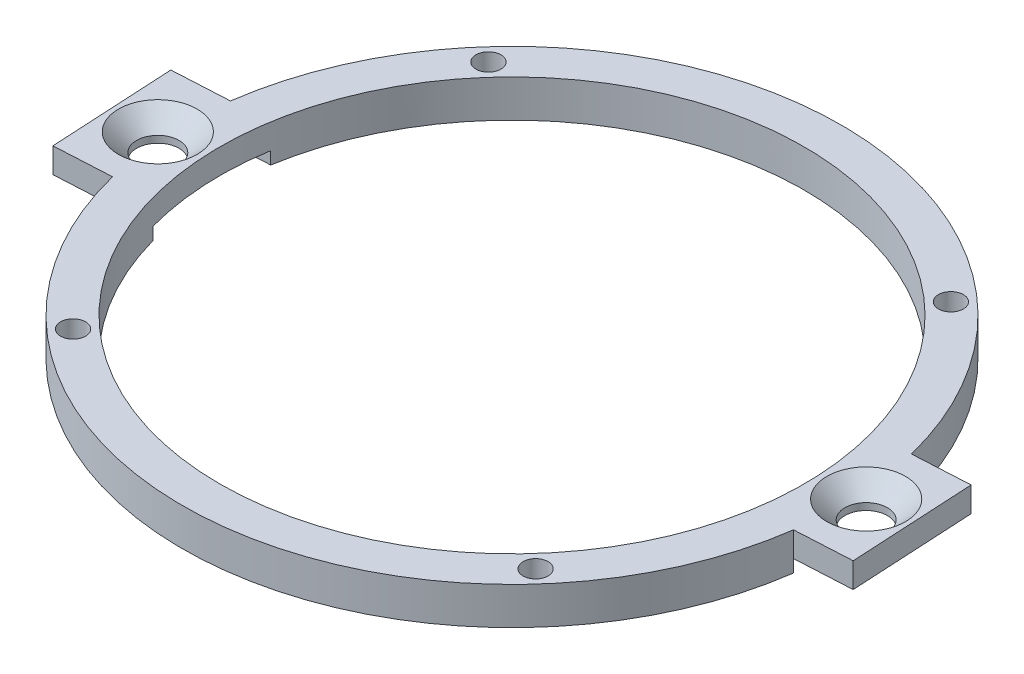
ISO-10303-21;
HEADER;
FILE_DESCRIPTION(('STEP AP214'),'2;1');
FILE_NAME('part.step','',(''),(''),'','','');
FILE_SCHEMA(('AUTOMOTIVE_DESIGN { 1 0 10303 214 1 1 1 1 }'));
ENDSEC;
DATA;
#1=APPLICATION_CONTEXT('core data for automotive mechanical design processes');
#2=APPLICATION_PROTOCOL_DEFINITION('international standard','automotive_design',2000,#1);
#3=PRODUCT_CONTEXT('',#1,'mechanical');
#4=PRODUCT('Part','Part','',(#3));
#5=PRODUCT_RELATED_PRODUCT_CATEGORY('part','',(#4));
#6=PRODUCT_DEFINITION_FORMATION('','',#4);
#7=PRODUCT_DEFINITION_CONTEXT('part definition',#1,'design');
#8=PRODUCT_DEFINITION('design','',#6,#7);
#9=PRODUCT_DEFINITION_SHAPE('','',#8);
#10=(LENGTH_UNIT() NAMED_UNIT(*) SI_UNIT(.MILLI.,.METRE.));
#11=(NAMED_UNIT(*) PLANE_ANGLE_UNIT() SI_UNIT($,.RADIAN.));
#12=(NAMED_UNIT(*) SI_UNIT($,.STERADIAN.) SOLID_ANGLE_UNIT());
#13=UNCERTAINTY_MEASURE_WITH_UNIT(LENGTH_MEASURE(1.E-05),#10,'distance_accuracy_value','');
#14=(GEOMETRIC_REPRESENTATION_CONTEXT(3) GLOBAL_UNCERTAINTY_ASSIGNED_CONTEXT((#13)) GLOBAL_UNIT_ASSIGNED_CONTEXT((#10,
#11,#12)) REPRESENTATION_CONTEXT('',''));
#15=CARTESIAN_POINT('',(0.,0.,0.));
#16=DIRECTION('',(0.,0.,1.));
#17=DIRECTION('',(1.,0.,0.));
#18=AXIS2_PLACEMENT_3D('',#15,#16,#17);
#19=CARTESIAN_POINT('',(-73.2496011945376,0.,33.2166503223374));
#20=DIRECTION('',(0.,1.,0.));
#21=DIRECTION('',(0.,0.,1.));
#22=AXIS2_PLACEMENT_3D('',#19,#20,#21);
#23=PLANE('',#22);
#24=CARTESIAN_POINT('',(-46.3204437022686,0.,31.7697568374789));
#25=DIRECTION('',(0.,1.,0.));
#26=DIRECTION('',(0.,0.,1.));
#27=AXIS2_PLACEMENT_3D('',#24,#25,#26);
#28=CIRCLE('',#27,1.7);
#29=CARTESIAN_POINT('',(-46.3204437022686,0.,33.4697568374789));
#30=VERTEX_POINT('',#29);
#31=EDGE_CURVE('E180',#30,#30,#28,.T.);
#32=ORIENTED_EDGE('',*,*,#31,.T.);
#33=EDGE_LOOP('',(#32));
#34=FACE_BOUND('',#33,.T.);
#35=CARTESIAN_POINT('',(-73.2496011945376,0.,33.2166503223374));
#36=DIRECTION('',(0.,1.,0.));
#37=DIRECTION('',(0.,0.,1.));
#38=AXIS2_PLACEMENT_3D('',#35,#36,#37);
#39=CIRCLE('',#38,23.4010000013006);
#40=CARTESIAN_POINT('',(-50.1536716128086,0.,36.9829267084631));
#41=VERTEX_POINT('',#40);
#42=CARTESIAN_POINT('',(-50.6901939670287,0.,26.997329892878));
#43=VERTEX_POINT('',#42);
#44=EDGE_CURVE('E53',#41,#43,#39,.T.);
#45=ORIENTED_EDGE('',*,*,#44,.T.);
#46=DIRECTION('',(0.998559681558508,0.,-0.0536522354219361));
#47=VECTOR('',#46,1.);
#48=CARTESIAN_POINT('',(-70.1361416443876,0.,28.0421533341369));
#49=LINE('',#48,#47);
#50=CARTESIAN_POINT('',(-47.6319903502109,0.,26.8330137649109));
#51=VERTEX_POINT('',#50);
#52=EDGE_CURVE('E145',#43,#51,#49,.T.);
#53=ORIENTED_EDGE('',*,*,#52,.T.);
#54=DIRECTION('',(-0.998559681558508,0.,0.053652235421936));
#55=VECTOR('',#54,1.);
#56=CARTESIAN_POINT('',(-46.6157156561829,0.,26.7784097085442));
#57=LINE('',#56,#55);
#58=CARTESIAN_POINT('',(-43.0937459939242,0.,26.5891756057077));
#59=VERTEX_POINT('',#58);
#60=EDGE_CURVE('E257',#59,#51,#57,.T.);
#61=ORIENTED_EDGE('',*,*,#60,.F.);
#62=DIRECTION('',(-0.0536522354219357,0.,-0.998559681558508));
#63=VECTOR('',#62,1.);
#64=CARTESIAN_POINT('',(-43.0937459939242,0.,26.5891756057077));
#65=LINE('',#64,#63);
#66=CARTESIAN_POINT('',(-42.5572236397049,0.,36.5747724212929));
#67=VERTEX_POINT('',#66);
#68=EDGE_CURVE('E282',#67,#59,#65,.T.);
#69=ORIENTED_EDGE('',*,*,#68,.F.);
#70=DIRECTION('',(0.998559681558508,0.,-0.0536522354219357));
#71=VECTOR('',#70,1.);
#72=CARTESIAN_POINT('',(-42.5572236397049,0.,36.5747724212929));
#73=LINE('',#72,#71);
#74=CARTESIAN_POINT('',(-47.0954679959909,0.,36.818610580496));
#75=VERTEX_POINT('',#74);
#76=EDGE_CURVE('E280',#75,#67,#73,.T.);
#77=ORIENTED_EDGE('',*,*,#76,.F.);
#78=DIRECTION('',(0.998559681558508,0.,-0.053652235421934));
#79=VECTOR('',#78,1.);
#80=CARTESIAN_POINT('',(-69.5996192901684,0.,38.0277501497219));
#81=LINE('',#80,#79);
#82=EDGE_CURVE('E147',#41,#75,#81,.T.);
#83=ORIENTED_EDGE('',*,*,#82,.F.);
#84=EDGE_LOOP('',(#45,#53,#61,#69,#77,#83));
#85=FACE_BOUND('',#84,.T.);
#86=ADVANCED_FACE('F36',(#34,#85),#23,.F.);
#87=CARTESIAN_POINT('',(-100.178758686809,0.,34.6635438071964));
#88=DIRECTION('',(0.,1.,0.));
#89=DIRECTION('',(0.,0.,1.));
#90=AXIS2_PLACEMENT_3D('',#87,#88,#89);
#91=CIRCLE('',#90,1.69999999999999);
#92=CARTESIAN_POINT('',(-100.178758686809,0.,36.3635438071964));
#93=VERTEX_POINT('',#92);
#94=EDGE_CURVE('E40',#93,#93,#91,.T.);
#95=ORIENTED_EDGE('',*,*,#94,.T.);
#96=EDGE_LOOP('',(#95));
#97=FACE_BOUND('',#96,.T.);
#98=DIRECTION('',(-0.998559681558508,0.,0.0536522354219358));
#99=VECTOR('',#98,1.);
#100=CARTESIAN_POINT('',(-103.941978749374,0.,29.8585282233788));
#101=LINE('',#100,#99);
#102=CARTESIAN_POINT('',(-99.4037343930838,0.,29.6146900641754));
#103=VERTEX_POINT('',#102);
#104=CARTESIAN_POINT('',(-103.941978749374,0.,29.8585282233788));
#105=VERTEX_POINT('',#104);
#106=EDGE_CURVE('E252',#103,#105,#101,.T.);
#107=ORIENTED_EDGE('',*,*,#106,.F.);
#108=DIRECTION('',(0.998559681558508,0.,-0.053652235421936));
#109=VECTOR('',#108,1.);
#110=CARTESIAN_POINT('',(-70.1361416443876,0.,28.0421533341369));
#111=LINE('',#110,#109);
#112=CARTESIAN_POINT('',(-96.3455307762661,0.,29.4503739362084));
#113=VERTEX_POINT('',#112);
#114=EDGE_CURVE('E164',#103,#113,#111,.T.);
#115=ORIENTED_EDGE('',*,*,#114,.T.);
#116=CARTESIAN_POINT('',(-95.8090084220474,0.,39.4359707517935));
#117=VERTEX_POINT('',#116);
#118=EDGE_CURVE('E61',#113,#117,#39,.T.);
#119=ORIENTED_EDGE('',*,*,#118,.T.);
#120=DIRECTION('',(0.998559681558508,0.,-0.0536522354219365));
#121=VECTOR('',#120,1.);
#122=CARTESIAN_POINT('',(-69.5996192901682,0.,38.0277501497219));
#123=LINE('',#122,#121);
#124=CARTESIAN_POINT('',(-98.8672120388651,0.,39.6002868797605));
#125=VERTEX_POINT('',#124);
#126=EDGE_CURVE('E191',#125,#117,#123,.T.);
#127=ORIENTED_EDGE('',*,*,#126,.F.);
#128=DIRECTION('',(0.998559681558508,0.,-0.0536522354219336));
#129=VECTOR('',#128,1.);
#130=CARTESIAN_POINT('',(-99.8834867328931,0.,39.6548909361273));
#131=LINE('',#130,#129);
#132=CARTESIAN_POINT('',(-103.405456395155,0.,39.8441250389639));
#133=VERTEX_POINT('',#132);
#134=EDGE_CURVE('E277',#133,#125,#131,.T.);
#135=ORIENTED_EDGE('',*,*,#134,.F.);
#136=DIRECTION('',(0.0536522354219374,0.,0.998559681558508));
#137=VECTOR('',#136,1.);
#138=CARTESIAN_POINT('',(-103.405456395155,0.,39.8441250389639));
#139=LINE('',#138,#137);
#140=EDGE_CURVE('E274',#105,#133,#139,.T.);
#141=ORIENTED_EDGE('',*,*,#140,.F.);
#142=EDGE_LOOP('',(#107,#115,#119,#127,#135,#141));
#143=FACE_BOUND('',#142,.T.);
#144=ADVANCED_FACE('F312',(#97,#143),#23,.F.);
#145=CARTESIAN_POINT('',(-73.2496011945376,2.,33.2166503223374));
#146=DIRECTION('',(0.,1.,0.));
#147=DIRECTION('',(0.,0.,1.));
#148=AXIS2_PLACEMENT_3D('',#145,#146,#147);
#149=PLANE('',#148);
#150=CARTESIAN_POINT('',(-100.178758686809,2.,34.6635438071964));
#151=DIRECTION('',(0.,1.,0.));
#152=DIRECTION('',(0.,0.,1.));
#153=AXIS2_PLACEMENT_3D('',#150,#151,#152);
#154=CIRCLE('',#153,3.15);
#155=CARTESIAN_POINT('',(-100.178758686809,2.,37.8135438071964));
#156=VERTEX_POINT('',#155);
#157=EDGE_CURVE('E396',#156,#156,#154,.T.);
#158=ORIENTED_EDGE('',*,*,#157,.F.);
#159=EDGE_LOOP('',(#158));
#160=FACE_BOUND('',#159,.T.);
#161=CARTESIAN_POINT('',(-46.3204437022686,2.,31.7697568374789));
#162=DIRECTION('',(0.,1.,0.));
#163=DIRECTION('',(0.,0.,1.));
#164=AXIS2_PLACEMENT_3D('',#161,#162,#163);
#165=CIRCLE('',#164,3.15);
#166=CARTESIAN_POINT('',(-46.3204437022686,2.,34.9197568374789));
#167=VERTEX_POINT('',#166);
#168=EDGE_CURVE('E400',#167,#167,#165,.T.);
#169=ORIENTED_EDGE('',*,*,#168,.F.);
#170=EDGE_LOOP('',(#169));
#171=FACE_BOUND('',#170,.T.);
#172=CARTESIAN_POINT('',(-89.8872158685172,2.,51.7436462748696));
#173=DIRECTION('',(0.,1.,0.));
#174=DIRECTION('',(0.,0.,1.));
#175=AXIS2_PLACEMENT_3D('',#172,#173,#174);
#176=CIRCLE('',#175,1.00000000000001);
#177=CARTESIAN_POINT('',(-89.8872158685172,2.,52.7436462748696));
#178=VERTEX_POINT('',#177);
#179=EDGE_CURVE('E228',#178,#178,#176,.T.);
#180=ORIENTED_EDGE('',*,*,#179,.F.);
#181=EDGE_LOOP('',(#180));
#182=FACE_BOUND('',#181,.T.);
#183=CARTESIAN_POINT('',(-54.7226052420054,2.,49.854264996317));
#184=DIRECTION('',(0.,1.,0.));
#185=DIRECTION('',(0.,0.,1.));
#186=AXIS2_PLACEMENT_3D('',#183,#184,#185);
#187=CIRCLE('',#186,0.999999999999998);
#188=CARTESIAN_POINT('',(-54.7226052420054,2.,50.854264996317));
#189=VERTEX_POINT('',#188);
#190=EDGE_CURVE('E233',#189,#189,#187,.T.);
#191=ORIENTED_EDGE('',*,*,#190,.F.);
#192=EDGE_LOOP('',(#191));
#193=FACE_BOUND('',#192,.T.);
#194=CARTESIAN_POINT('',(-56.611986520558,2.,14.6896543698051));
#195=DIRECTION('',(0.,1.,0.));
#196=DIRECTION('',(0.,0.,1.));
#197=AXIS2_PLACEMENT_3D('',#194,#195,#196);
#198=CIRCLE('',#197,0.999999999999998);
#199=CARTESIAN_POINT('',(-56.611986520558,2.,15.6896543698051));
#200=VERTEX_POINT('',#199);
#201=EDGE_CURVE('E244',#200,#200,#198,.T.);
#202=ORIENTED_EDGE('',*,*,#201,.F.);
#203=EDGE_LOOP('',(#202));
#204=FACE_BOUND('',#203,.T.);
#205=CARTESIAN_POINT('',(-91.7765971470699,2.,16.5790356483579));
#206=DIRECTION('',(0.,1.,0.));
#207=DIRECTION('',(0.,0.,1.));
#208=AXIS2_PLACEMENT_3D('',#205,#206,#207);
#209=CIRCLE('',#208,0.999999999999998);
#210=CARTESIAN_POINT('',(-91.7765971470699,2.,17.5790356483579));
#211=VERTEX_POINT('',#210);
#212=EDGE_CURVE('E218',#211,#211,#209,.T.);
#213=ORIENTED_EDGE('',*,*,#212,.F.);
#214=EDGE_LOOP('',(#213));
#215=FACE_BOUND('',#214,.T.);
#216=DIRECTION('',(-0.998559681558508,0.,0.0536522354219358));
#217=VECTOR('',#216,1.);
#218=CARTESIAN_POINT('',(-47.6319903502109,2.,26.8330137649109));
#219=LINE('',#218,#217);
#220=CARTESIAN_POINT('',(-43.0937459939242,2.,26.5891756057077));
#221=VERTEX_POINT('',#220);
#222=CARTESIAN_POINT('',(-47.6319903502109,2.,26.8330137649109));
#223=VERTEX_POINT('',#222);
#224=EDGE_CURVE('E253',#221,#223,#219,.T.);
#225=ORIENTED_EDGE('',*,*,#224,.T.);
#226=CARTESIAN_POINT('',(-73.2496011945376,2.,33.2166503223374));
#227=DIRECTION('',(0.,1.,0.));
#228=DIRECTION('',(0.,0.,1.));
#229=AXIS2_PLACEMENT_3D('',#226,#227,#228);
#230=CIRCLE('',#229,26.4010000013006);
#231=CARTESIAN_POINT('',(-99.4037343930838,2.,29.6146900641754));
#232=VERTEX_POINT('',#231);
#233=EDGE_CURVE('E256',#223,#232,#230,.T.);
#234=ORIENTED_EDGE('',*,*,#233,.T.);
#235=DIRECTION('',(-0.998559681558508,0.,0.0536522354219328));
#236=VECTOR('',#235,1.);
#237=CARTESIAN_POINT('',(-100.420009087112,2.,29.6692941205422));
#238=LINE('',#237,#236);
#239=CARTESIAN_POINT('',(-103.941978749374,2.,29.8585282233788));
#240=VERTEX_POINT('',#239);
#241=EDGE_CURVE('E259',#232,#240,#238,.T.);
#242=ORIENTED_EDGE('',*,*,#241,.T.);
#243=DIRECTION('',(0.0536522354219374,0.,0.998559681558508));
#244=VECTOR('',#243,1.);
#245=CARTESIAN_POINT('',(-103.405456395155,2.,39.8441250389639));
#246=LINE('',#245,#244);
#247=CARTESIAN_POINT('',(-103.405456395155,2.,39.8441250389639));
#248=VERTEX_POINT('',#247);
#249=EDGE_CURVE('E261',#240,#248,#246,.T.);
#250=ORIENTED_EDGE('',*,*,#249,.T.);
#251=DIRECTION('',(0.998559681558508,0.,-0.0536522354219359));
#252=VECTOR('',#251,1.);
#253=CARTESIAN_POINT('',(-99.8834867328931,2.,39.6548909361273));
#254=LINE('',#253,#252);
#255=CARTESIAN_POINT('',(-98.8672120388651,2.,39.6002868797605));
#256=VERTEX_POINT('',#255);
#257=EDGE_CURVE('E263',#248,#256,#254,.T.);
#258=ORIENTED_EDGE('',*,*,#257,.T.);
#259=CARTESIAN_POINT('',(-73.2496011945376,2.,33.2166503223374));
#260=DIRECTION('',(0.,1.,0.));
#261=DIRECTION('',(0.,0.,1.));
#262=AXIS2_PLACEMENT_3D('',#259,#260,#261);
#263=CIRCLE('',#262,26.4010000013006);
#264=CARTESIAN_POINT('',(-47.0954679959909,2.,36.818610580496));
#265=VERTEX_POINT('',#264);
#266=EDGE_CURVE('E265',#256,#265,#263,.T.);
#267=ORIENTED_EDGE('',*,*,#266,.T.);
#268=DIRECTION('',(0.998559681558508,0.,-0.0536522354219336));
#269=VECTOR('',#268,1.);
#270=CARTESIAN_POINT('',(-47.0954679959909,2.,36.818610580496));
#271=LINE('',#270,#269);
#272=CARTESIAN_POINT('',(-42.5572236397049,2.,36.5747724212929));
#273=VERTEX_POINT('',#272);
#274=EDGE_CURVE('E267',#265,#273,#271,.T.);
#275=ORIENTED_EDGE('',*,*,#274,.T.);
#276=DIRECTION('',(-0.0536522354219357,0.,-0.998559681558508));
#277=VECTOR('',#276,1.);
#278=CARTESIAN_POINT('',(-43.0937459939242,2.,26.5891756057077));
#279=LINE('',#278,#277);
#280=EDGE_CURVE('E269',#273,#221,#279,.T.);
#281=ORIENTED_EDGE('',*,*,#280,.T.);
#282=EDGE_LOOP('',(#225,#234,#242,#250,#258,#267,#275,#281));
#283=FACE_BOUND('',#282,.T.);
#284=CARTESIAN_POINT('',(-73.2496011945376,2.,33.2166503223374));
#285=DIRECTION('',(0.,1.,0.));
#286=DIRECTION('',(0.,0.,1.));
#287=AXIS2_PLACEMENT_3D('',#284,#285,#286);
#288=CIRCLE('',#287,23.4010000013006);
#289=CARTESIAN_POINT('',(-73.2496011945376,2.,56.6176503236381));
#290=VERTEX_POINT('',#289);
#291=EDGE_CURVE('E249',#290,#290,#288,.T.);
#292=ORIENTED_EDGE('',*,*,#291,.F.);
#293=EDGE_LOOP('',(#292));
#294=FACE_BOUND('',#293,.T.);
#295=ADVANCED_FACE('F324',(#160,#171,#182,#193,#204,#215,#283,#294),#149,.T.);
#296=CARTESIAN_POINT('',(-73.2496011945376,2.,33.2166503223374));
#297=DIRECTION('',(0.,-1.,0.));
#298=DIRECTION('',(0.,0.,-1.));
#299=AXIS2_PLACEMENT_3D('',#296,#297,#298);
#300=CYLINDRICAL_SURFACE('',#299,26.4010000013006);
#301=DIRECTION('',(0.,-1.,0.));
#302=VECTOR('',#301,1.);
#303=CARTESIAN_POINT('',(-47.6319903502109,2.,26.8330137649109));
#304=LINE('',#303,#302);
#305=EDGE_CURVE('E11',#223,#51,#304,.T.);
#306=ORIENTED_EDGE('',*,*,#305,.T.);
#307=DIRECTION('',(0.,1.,0.));
#308=VECTOR('',#307,1.);
#309=CARTESIAN_POINT('',(-47.6319903502109,-1.,26.8330137649109));
#310=LINE('',#309,#308);
#311=CARTESIAN_POINT('',(-47.6319903502109,-1.,26.8330137649109));
#312=VERTEX_POINT('',#311);
#313=EDGE_CURVE('E179',#312,#51,#310,.T.);
#314=ORIENTED_EDGE('',*,*,#313,.F.);
#315=CARTESIAN_POINT('',(-73.2496011945376,-1.,33.2166503223374));
#316=DIRECTION('',(0.,-1.,0.));
#317=DIRECTION('',(0.,0.,-1.));
#318=AXIS2_PLACEMENT_3D('',#315,#316,#317);
#319=CIRCLE('',#318,26.4010000013006);
#320=CARTESIAN_POINT('',(-99.4037343930838,-1.,29.6146900641754));
#321=VERTEX_POINT('',#320);
#322=EDGE_CURVE('E162',#321,#312,#319,.T.);
#323=ORIENTED_EDGE('',*,*,#322,.F.);
#324=DIRECTION('',(0.,1.,0.));
#325=VECTOR('',#324,1.);
#326=CARTESIAN_POINT('',(-99.4037343930838,-1.,29.6146900641754));
#327=LINE('',#326,#325);
#328=EDGE_CURVE('E183',#321,#103,#327,.T.);
#329=ORIENTED_EDGE('',*,*,#328,.T.);
#330=DIRECTION('',(0.,-1.,0.));
#331=VECTOR('',#330,1.);
#332=CARTESIAN_POINT('',(-99.4037343930838,2.,29.6146900641754));
#333=LINE('',#332,#331);
#334=EDGE_CURVE('E45',#232,#103,#333,.T.);
#335=ORIENTED_EDGE('',*,*,#334,.F.);
#336=ORIENTED_EDGE('',*,*,#233,.F.);
#337=EDGE_LOOP('',(#306,#314,#323,#329,#335,#336));
#338=FACE_BOUND('',#337,.T.);
#339=ADVANCED_FACE('F38',(#338),#300,.T.);
#340=CARTESIAN_POINT('',(-103.941978749374,2.,29.8585282233788));
#341=DIRECTION('',(0.0536522354219358,0.,0.998559681558508));
#342=DIRECTION('',(0.998559681558508,0.,-0.0536522354219358));
#343=AXIS2_PLACEMENT_3D('',#340,#341,#342);
#344=PLANE('',#343);
#345=ORIENTED_EDGE('',*,*,#106,.T.);
#346=DIRECTION('',(0.,-1.,0.));
#347=VECTOR('',#346,1.);
#348=CARTESIAN_POINT('',(-103.941978749374,2.,29.8585282233788));
#349=LINE('',#348,#347);
#350=EDGE_CURVE('E299',#240,#105,#349,.T.);
#351=ORIENTED_EDGE('',*,*,#350,.F.);
#352=ORIENTED_EDGE('',*,*,#241,.F.);
#353=ORIENTED_EDGE('',*,*,#334,.T.);
#354=EDGE_LOOP('',(#345,#351,#352,#353));
#355=FACE_BOUND('',#354,.T.);
#356=ADVANCED_FACE('F306',(#355),#344,.F.);
#357=CARTESIAN_POINT('',(-103.405456395155,2.,39.8441250389639));
#358=DIRECTION('',(0.998559681558508,0.,-0.0536522354219373));
#359=DIRECTION('',(-0.0536522354219374,0.,-0.998559681558508));
#360=AXIS2_PLACEMENT_3D('',#357,#358,#359);
#361=PLANE('',#360);
#362=ORIENTED_EDGE('',*,*,#140,.T.);
#363=DIRECTION('',(0.,-1.,0.));
#364=VECTOR('',#363,1.);
#365=CARTESIAN_POINT('',(-103.405456395155,2.,39.8441250389639));
#366=LINE('',#365,#364);
#367=EDGE_CURVE('E296',#248,#133,#366,.T.);
#368=ORIENTED_EDGE('',*,*,#367,.F.);
#369=ORIENTED_EDGE('',*,*,#249,.F.);
#370=ORIENTED_EDGE('',*,*,#350,.T.);
#371=EDGE_LOOP('',(#362,#368,#369,#370));
#372=FACE_BOUND('',#371,.T.);
#373=ADVANCED_FACE('F316',(#372),#361,.F.);
#374=CARTESIAN_POINT('',(-99.8834867328931,2.,39.6548909361273));
#375=DIRECTION('',(-0.0536522354219336,0.,-0.998559681558508));
#376=DIRECTION('',(-0.998559681558508,0.,0.0536522354219336));
#377=AXIS2_PLACEMENT_3D('',#374,#375,#376);
#378=PLANE('',#377);
#379=ORIENTED_EDGE('',*,*,#134,.T.);
#380=DIRECTION('',(0.,-1.,0.));
#381=VECTOR('',#380,1.);
#382=CARTESIAN_POINT('',(-98.8672120388651,2.,39.6002868797605));
#383=LINE('',#382,#381);
#384=EDGE_CURVE('E293',#256,#125,#383,.T.);
#385=ORIENTED_EDGE('',*,*,#384,.F.);
#386=ORIENTED_EDGE('',*,*,#257,.F.);
#387=ORIENTED_EDGE('',*,*,#367,.T.);
#388=EDGE_LOOP('',(#379,#385,#386,#387));
#389=FACE_BOUND('',#388,.T.);
#390=ADVANCED_FACE('F320',(#389),#378,.F.);
#391=CARTESIAN_POINT('',(-73.2496011945376,2.,33.2166503223374));
#392=DIRECTION('',(0.,-1.,0.));
#393=DIRECTION('',(0.,0.,-1.));
#394=AXIS2_PLACEMENT_3D('',#391,#392,#393);
#395=CYLINDRICAL_SURFACE('',#394,26.4010000013006);
#396=ORIENTED_EDGE('',*,*,#384,.T.);
#397=DIRECTION('',(0.,1.,0.));
#398=VECTOR('',#397,1.);
#399=CARTESIAN_POINT('',(-98.8672120388651,-1.,39.6002868797606));
#400=LINE('',#399,#398);
#401=CARTESIAN_POINT('',(-98.8672120388651,-1.,39.6002868797606));
#402=VERTEX_POINT('',#401);
#403=EDGE_CURVE('E206',#402,#125,#400,.T.);
#404=ORIENTED_EDGE('',*,*,#403,.F.);
#405=CARTESIAN_POINT('',(-73.2496011945376,-1.,33.2166503223374));
#406=DIRECTION('',(0.,-1.,0.));
#407=DIRECTION('',(0.,0.,-1.));
#408=AXIS2_PLACEMENT_3D('',#405,#406,#407);
#409=CIRCLE('',#408,26.4010000013006);
#410=CARTESIAN_POINT('',(-47.0954679959909,-1.,36.818610580496));
#411=VERTEX_POINT('',#410);
#412=EDGE_CURVE('E199',#411,#402,#409,.T.);
#413=ORIENTED_EDGE('',*,*,#412,.F.);
#414=DIRECTION('',(0.,1.,0.));
#415=VECTOR('',#414,1.);
#416=CARTESIAN_POINT('',(-47.0954679959909,-1.,36.818610580496));
#417=LINE('',#416,#415);
#418=EDGE_CURVE('E229',#411,#75,#417,.T.);
#419=ORIENTED_EDGE('',*,*,#418,.T.);
#420=DIRECTION('',(0.,-1.,0.));
#421=VECTOR('',#420,1.);
#422=CARTESIAN_POINT('',(-47.0954679959909,2.,36.818610580496));
#423=LINE('',#422,#421);
#424=EDGE_CURVE('E291',#265,#75,#423,.T.);
#425=ORIENTED_EDGE('',*,*,#424,.F.);
#426=ORIENTED_EDGE('',*,*,#266,.F.);
#427=EDGE_LOOP('',(#396,#404,#413,#419,#425,#426));
#428=FACE_BOUND('',#427,.T.);
#429=ADVANCED_FACE('F340',(#428),#395,.T.);
#430=CARTESIAN_POINT('',(-42.5572236397049,2.,36.5747724212929));
#431=DIRECTION('',(-0.0536522354219358,0.,-0.998559681558508));
#432=DIRECTION('',(-0.998559681558508,0.,0.0536522354219358));
#433=AXIS2_PLACEMENT_3D('',#430,#431,#432);
#434=PLANE('',#433);
#435=ORIENTED_EDGE('',*,*,#76,.T.);
#436=DIRECTION('',(0.,-1.,0.));
#437=VECTOR('',#436,1.);
#438=CARTESIAN_POINT('',(-42.5572236397049,2.,36.5747724212929));
#439=LINE('',#438,#437);
#440=EDGE_CURVE('E288',#273,#67,#439,.T.);
#441=ORIENTED_EDGE('',*,*,#440,.F.);
#442=ORIENTED_EDGE('',*,*,#274,.F.);
#443=ORIENTED_EDGE('',*,*,#424,.T.);
#444=EDGE_LOOP('',(#435,#441,#442,#443));
#445=FACE_BOUND('',#444,.T.);
#446=ADVANCED_FACE('F339',(#445),#434,.F.);
#447=CARTESIAN_POINT('',(-43.0937459939242,2.,26.5891756057077));
#448=DIRECTION('',(-0.998559681558508,0.,0.0536522354219357));
#449=DIRECTION('',(0.0536522354219357,0.,0.998559681558508));
#450=AXIS2_PLACEMENT_3D('',#447,#448,#449);
#451=PLANE('',#450);
#452=ORIENTED_EDGE('',*,*,#68,.T.);
#453=DIRECTION('',(0.,-1.,0.));
#454=VECTOR('',#453,1.);
#455=CARTESIAN_POINT('',(-43.0937459939242,2.,26.5891756057077));
#456=LINE('',#455,#454);
#457=EDGE_CURVE('E272',#221,#59,#456,.T.);
#458=ORIENTED_EDGE('',*,*,#457,.F.);
#459=ORIENTED_EDGE('',*,*,#280,.F.);
#460=ORIENTED_EDGE('',*,*,#440,.T.);
#461=EDGE_LOOP('',(#452,#458,#459,#460));
#462=FACE_BOUND('',#461,.T.);
#463=ADVANCED_FACE('F334',(#462),#451,.F.);
#464=CARTESIAN_POINT('',(-46.6157156561829,2.,26.7784097085442));
#465=DIRECTION('',(0.053652235421936,0.,0.998559681558508));
#466=DIRECTION('',(0.998559681558508,0.,-0.053652235421936));
#467=AXIS2_PLACEMENT_3D('',#464,#465,#466);
#468=PLANE('',#467);
#469=ORIENTED_EDGE('',*,*,#60,.T.);
#470=ORIENTED_EDGE('',*,*,#305,.F.);
#471=ORIENTED_EDGE('',*,*,#224,.F.);
#472=ORIENTED_EDGE('',*,*,#457,.T.);
#473=EDGE_LOOP('',(#469,#470,#471,#472));
#474=FACE_BOUND('',#473,.T.);
#475=ADVANCED_FACE('F328',(#474),#468,.F.);
#476=CARTESIAN_POINT('',(-73.2496011945376,2.,33.2166503223374));
#477=DIRECTION('',(0.,-1.,0.));
#478=DIRECTION('',(0.,0.,-1.));
#479=AXIS2_PLACEMENT_3D('',#476,#477,#478);
#480=CYLINDRICAL_SURFACE('',#479,23.4010000013006);
#481=ORIENTED_EDGE('',*,*,#291,.T.);
#482=EDGE_LOOP('',(#481));
#483=FACE_BOUND('',#482,.T.);
#484=ORIENTED_EDGE('',*,*,#44,.F.);
#485=DIRECTION('',(0.,1.,0.));
#486=VECTOR('',#485,1.);
#487=CARTESIAN_POINT('',(-50.1536716128086,-1.,36.9829267084631));
#488=LINE('',#487,#486);
#489=CARTESIAN_POINT('',(-50.1536716128086,-1.,36.9829267084631));
#490=VERTEX_POINT('',#489);
#491=EDGE_CURVE('E226',#490,#41,#488,.T.);
#492=ORIENTED_EDGE('',*,*,#491,.F.);
#493=CARTESIAN_POINT('',(-73.2496011945376,-1.,33.2166503223374));
#494=DIRECTION('',(0.,-1.,0.));
#495=DIRECTION('',(0.,0.,-1.));
#496=AXIS2_PLACEMENT_3D('',#493,#494,#495);
#497=CIRCLE('',#496,23.4010000013006);
#498=CARTESIAN_POINT('',(-95.8090084220474,-1.,39.4359707517935));
#499=VERTEX_POINT('',#498);
#500=EDGE_CURVE('E194',#499,#490,#497,.F.);
#501=ORIENTED_EDGE('',*,*,#500,.F.);
#502=DIRECTION('',(0.,1.,0.));
#503=VECTOR('',#502,1.);
#504=CARTESIAN_POINT('',(-95.8090084220474,-1.,39.4359707517935));
#505=LINE('',#504,#503);
#506=EDGE_CURVE('E203',#499,#117,#505,.T.);
#507=ORIENTED_EDGE('',*,*,#506,.T.);
#508=ORIENTED_EDGE('',*,*,#118,.F.);
#509=DIRECTION('',(0.,1.,0.));
#510=VECTOR('',#509,1.);
#511=CARTESIAN_POINT('',(-96.3455307762661,-1.,29.4503739362084));
#512=LINE('',#511,#510);
#513=CARTESIAN_POINT('',(-96.3455307762661,-1.,29.4503739362084));
#514=VERTEX_POINT('',#513);
#515=EDGE_CURVE('E148',#514,#113,#512,.T.);
#516=ORIENTED_EDGE('',*,*,#515,.F.);
#517=CARTESIAN_POINT('',(-73.2496011945376,-1.,33.2166503223374));
#518=DIRECTION('',(0.,-1.,0.));
#519=DIRECTION('',(0.,0.,-1.));
#520=AXIS2_PLACEMENT_3D('',#517,#518,#519);
#521=CIRCLE('',#520,23.4010000013006);
#522=CARTESIAN_POINT('',(-50.6901939670287,-1.,26.997329892878));
#523=VERTEX_POINT('',#522);
#524=EDGE_CURVE('E151',#523,#514,#521,.F.);
#525=ORIENTED_EDGE('',*,*,#524,.F.);
#526=DIRECTION('',(0.,1.,0.));
#527=VECTOR('',#526,1.);
#528=CARTESIAN_POINT('',(-50.6901939670287,-1.,26.997329892878));
#529=LINE('',#528,#527);
#530=EDGE_CURVE('E139',#523,#43,#529,.T.);
#531=ORIENTED_EDGE('',*,*,#530,.T.);
#532=EDGE_LOOP('',(#484,#492,#501,#507,#508,#516,#525,#531));
#533=FACE_BOUND('',#532,.T.);
#534=ADVANCED_FACE('F152',(#483,#533),#480,.F.);
#535=CARTESIAN_POINT('',(-91.7765971470699,-8.,16.5790356483579));
#536=DIRECTION('',(0.,1.,0.));
#537=DIRECTION('',(0.,0.,1.));
#538=AXIS2_PLACEMENT_3D('',#535,#536,#537);
#539=CYLINDRICAL_SURFACE('',#538,0.999999999999998);
#540=ORIENTED_EDGE('',*,*,#212,.T.);
#541=EDGE_LOOP('',(#540));
#542=FACE_BOUND('',#541,.T.);
#543=CARTESIAN_POINT('',(-91.7765971470699,-1.,16.5790356483579));
#544=DIRECTION('',(0.,-1.,0.));
#545=DIRECTION('',(0.,0.,-1.));
#546=AXIS2_PLACEMENT_3D('',#543,#544,#545);
#547=CIRCLE('',#546,0.999999999999998);
#548=CARTESIAN_POINT('',(-91.7765971470699,-1.,15.5790356483579));
#549=VERTEX_POINT('',#548);
#550=EDGE_CURVE('E173',#549,#549,#547,.F.);
#551=ORIENTED_EDGE('',*,*,#550,.F.);
#552=EDGE_LOOP('',(#551));
#553=FACE_BOUND('',#552,.T.);
#554=ADVANCED_FACE('F409',(#542,#553),#539,.F.);
#555=CARTESIAN_POINT('',(-56.611986520558,-8.,14.6896543698051));
#556=DIRECTION('',(0.,1.,0.));
#557=DIRECTION('',(0.,0.,1.));
#558=AXIS2_PLACEMENT_3D('',#555,#556,#557);
#559=CYLINDRICAL_SURFACE('',#558,0.999999999999998);
#560=ORIENTED_EDGE('',*,*,#201,.T.);
#561=EDGE_LOOP('',(#560));
#562=FACE_BOUND('',#561,.T.);
#563=CARTESIAN_POINT('',(-56.611986520558,-1.,14.6896543698051));
#564=DIRECTION('',(0.,-1.,0.));
#565=DIRECTION('',(0.,0.,-1.));
#566=AXIS2_PLACEMENT_3D('',#563,#564,#565);
#567=CIRCLE('',#566,0.999999999999998);
#568=CARTESIAN_POINT('',(-56.611986520558,-1.,13.6896543698051));
#569=VERTEX_POINT('',#568);
#570=EDGE_CURVE('E176',#569,#569,#567,.F.);
#571=ORIENTED_EDGE('',*,*,#570,.F.);
#572=EDGE_LOOP('',(#571));
#573=FACE_BOUND('',#572,.T.);
#574=ADVANCED_FACE('F412',(#562,#573),#559,.F.);
#575=CARTESIAN_POINT('',(-54.7226052420054,-8.,49.854264996317));
#576=DIRECTION('',(0.,1.,0.));
#577=DIRECTION('',(0.,0.,1.));
#578=AXIS2_PLACEMENT_3D('',#575,#576,#577);
#579=CYLINDRICAL_SURFACE('',#578,0.999999999999998);
#580=ORIENTED_EDGE('',*,*,#190,.T.);
#581=EDGE_LOOP('',(#580));
#582=FACE_BOUND('',#581,.T.);
#583=CARTESIAN_POINT('',(-54.7226052420054,-1.,49.854264996317));
#584=DIRECTION('',(0.,-1.,0.));
#585=DIRECTION('',(0.,0.,-1.));
#586=AXIS2_PLACEMENT_3D('',#583,#584,#585);
#587=CIRCLE('',#586,0.999999999999998);
#588=CARTESIAN_POINT('',(-54.7226052420054,-1.,48.854264996317));
#589=VERTEX_POINT('',#588);
#590=EDGE_CURVE('E190',#589,#589,#587,.F.);
#591=ORIENTED_EDGE('',*,*,#590,.F.);
#592=EDGE_LOOP('',(#591));
#593=FACE_BOUND('',#592,.T.);
#594=ADVANCED_FACE('F358',(#582,#593),#579,.F.);
#595=CARTESIAN_POINT('',(-89.8872158685172,-8.,51.7436462748696));
#596=DIRECTION('',(0.,1.,0.));
#597=DIRECTION('',(0.,0.,1.));
#598=AXIS2_PLACEMENT_3D('',#595,#596,#597);
#599=CYLINDRICAL_SURFACE('',#598,1.00000000000001);
#600=ORIENTED_EDGE('',*,*,#179,.T.);
#601=EDGE_LOOP('',(#600));
#602=FACE_BOUND('',#601,.T.);
#603=CARTESIAN_POINT('',(-89.8872158685172,-1.,51.7436462748696));
#604=DIRECTION('',(0.,-1.,0.));
#605=DIRECTION('',(0.,0.,-1.));
#606=AXIS2_PLACEMENT_3D('',#603,#604,#605);
#607=CIRCLE('',#606,1.00000000000001);
#608=CARTESIAN_POINT('',(-89.8872158685172,-1.,50.7436462748696));
#609=VERTEX_POINT('',#608);
#610=EDGE_CURVE('E187',#609,#609,#607,.F.);
#611=ORIENTED_EDGE('',*,*,#610,.F.);
#612=EDGE_LOOP('',(#611));
#613=FACE_BOUND('',#612,.T.);
#614=ADVANCED_FACE('F351',(#602,#613),#599,.F.);
#615=CARTESIAN_POINT('',(-69.5996192901684,-1.,38.0277501497219));
#616=DIRECTION('',(0.053652235421934,0.,0.998559681558508));
#617=DIRECTION('',(0.998559681558508,0.,-0.053652235421934));
#618=AXIS2_PLACEMENT_3D('',#615,#616,#617);
#619=PLANE('',#618);
#620=ORIENTED_EDGE('',*,*,#82,.T.);
#621=ORIENTED_EDGE('',*,*,#418,.F.);
#622=DIRECTION('',(0.998559681558508,0.,-0.053652235421934));
#623=VECTOR('',#622,1.);
#624=CARTESIAN_POINT('',(-69.5996192901684,-1.,38.0277501497219));
#625=LINE('',#624,#623);
#626=EDGE_CURVE('E197',#490,#411,#625,.T.);
#627=ORIENTED_EDGE('',*,*,#626,.F.);
#628=ORIENTED_EDGE('',*,*,#491,.T.);
#629=EDGE_LOOP('',(#620,#621,#627,#628));
#630=FACE_BOUND('',#629,.T.);
#631=ADVANCED_FACE('F349',(#630),#619,.F.);
#632=CARTESIAN_POINT('',(-69.5996192901682,-1.,38.0277501497219));
#633=DIRECTION('',(0.0536522354219365,0.,0.998559681558508));
#634=DIRECTION('',(0.998559681558508,0.,-0.0536522354219365));
#635=AXIS2_PLACEMENT_3D('',#632,#633,#634);
#636=PLANE('',#635);
#637=ORIENTED_EDGE('',*,*,#126,.T.);
#638=ORIENTED_EDGE('',*,*,#506,.F.);
#639=DIRECTION('',(0.998559681558508,0.,-0.0536522354219365));
#640=VECTOR('',#639,1.);
#641=CARTESIAN_POINT('',(-69.5996192901682,-1.,38.0277501497219));
#642=LINE('',#641,#640);
#643=EDGE_CURVE('E201',#402,#499,#642,.T.);
#644=ORIENTED_EDGE('',*,*,#643,.F.);
#645=ORIENTED_EDGE('',*,*,#403,.T.);
#646=EDGE_LOOP('',(#637,#638,#644,#645));
#647=FACE_BOUND('',#646,.T.);
#648=ADVANCED_FACE('F344',(#647),#636,.F.);
#649=CARTESIAN_POINT('',(-73.2496011945394,-1.,-29.9046433369619));
#650=DIRECTION('',(0.,-1.,0.));
#651=DIRECTION('',(0.,0.,-1.));
#652=AXIS2_PLACEMENT_3D('',#649,#650,#651);
#653=PLANE('',#652);
#654=ORIENTED_EDGE('',*,*,#610,.T.);
#655=EDGE_LOOP('',(#654));
#656=FACE_BOUND('',#655,.T.);
#657=ORIENTED_EDGE('',*,*,#590,.T.);
#658=EDGE_LOOP('',(#657));
#659=FACE_BOUND('',#658,.T.);
#660=ORIENTED_EDGE('',*,*,#500,.T.);
#661=ORIENTED_EDGE('',*,*,#626,.T.);
#662=ORIENTED_EDGE('',*,*,#412,.T.);
#663=ORIENTED_EDGE('',*,*,#643,.T.);
#664=EDGE_LOOP('',(#660,#661,#662,#663));
#665=FACE_BOUND('',#664,.T.);
#666=ADVANCED_FACE('F348',(#656,#659,#665),#653,.T.);
#667=CARTESIAN_POINT('',(-70.1361416443876,-1.,28.0421533341369));
#668=DIRECTION('',(0.0536522354219361,0.,0.998559681558508));
#669=DIRECTION('',(0.998559681558508,0.,-0.0536522354219361));
#670=AXIS2_PLACEMENT_3D('',#667,#668,#669);
#671=PLANE('',#670);
#672=ORIENTED_EDGE('',*,*,#52,.F.);
#673=ORIENTED_EDGE('',*,*,#530,.F.);
#674=DIRECTION('',(0.998559681558508,0.,-0.0536522354219361));
#675=VECTOR('',#674,1.);
#676=CARTESIAN_POINT('',(-70.1361416443876,-1.,28.0421533341369));
#677=LINE('',#676,#675);
#678=EDGE_CURVE('E144',#523,#312,#677,.T.);
#679=ORIENTED_EDGE('',*,*,#678,.T.);
#680=ORIENTED_EDGE('',*,*,#313,.T.);
#681=EDGE_LOOP('',(#672,#673,#679,#680));
#682=FACE_BOUND('',#681,.T.);
#683=ADVANCED_FACE('F141',(#682),#671,.T.);
#684=CARTESIAN_POINT('',(-70.1361416443876,-1.,28.0421533341369));
#685=DIRECTION('',(0.053652235421936,0.,0.998559681558508));
#686=DIRECTION('',(0.998559681558508,0.,-0.053652235421936));
#687=AXIS2_PLACEMENT_3D('',#684,#685,#686);
#688=PLANE('',#687);
#689=ORIENTED_EDGE('',*,*,#114,.F.);
#690=ORIENTED_EDGE('',*,*,#328,.F.);
#691=DIRECTION('',(0.998559681558508,0.,-0.053652235421936));
#692=VECTOR('',#691,1.);
#693=CARTESIAN_POINT('',(-70.1361416443876,-1.,28.0421533341369));
#694=LINE('',#693,#692);
#695=EDGE_CURVE('E157',#321,#514,#694,.T.);
#696=ORIENTED_EDGE('',*,*,#695,.T.);
#697=ORIENTED_EDGE('',*,*,#515,.T.);
#698=EDGE_LOOP('',(#689,#690,#696,#697));
#699=FACE_BOUND('',#698,.T.);
#700=ADVANCED_FACE('F311',(#699),#688,.T.);
#701=CARTESIAN_POINT('',(-73.2496011945394,-1.,-29.9046433369619));
#702=DIRECTION('',(0.,-1.,0.));
#703=DIRECTION('',(0.,0.,-1.));
#704=AXIS2_PLACEMENT_3D('',#701,#702,#703);
#705=PLANE('',#704);
#706=ORIENTED_EDGE('',*,*,#678,.F.);
#707=ORIENTED_EDGE('',*,*,#524,.T.);
#708=ORIENTED_EDGE('',*,*,#695,.F.);
#709=ORIENTED_EDGE('',*,*,#322,.T.);
#710=EDGE_LOOP('',(#706,#707,#708,#709));
#711=FACE_BOUND('',#710,.T.);
#712=ORIENTED_EDGE('',*,*,#550,.T.);
#713=EDGE_LOOP('',(#712));
#714=FACE_BOUND('',#713,.T.);
#715=ORIENTED_EDGE('',*,*,#570,.T.);
#716=EDGE_LOOP('',(#715));
#717=FACE_BOUND('',#716,.T.);
#718=ADVANCED_FACE('F159',(#711,#714,#717),#705,.T.);
#719=CARTESIAN_POINT('',(-46.3204437022686,2.,31.7697568374789));
#720=DIRECTION('',(0.,1.,0.));
#721=DIRECTION('',(0.,0.,1.));
#722=AXIS2_PLACEMENT_3D('',#719,#720,#721);
#723=CYLINDRICAL_SURFACE('',#722,1.7);
#724=CARTESIAN_POINT('',(-46.3204437022686,0.549999999999998,31.7697568374789));
#725=DIRECTION('',(0.,1.,0.));
#726=DIRECTION('',(0.,0.,1.));
#727=AXIS2_PLACEMENT_3D('',#724,#725,#726);
#728=CIRCLE('',#727,1.7);
#729=CARTESIAN_POINT('',(-46.3204437022686,0.549999999999998,33.4697568374789));
#730=VERTEX_POINT('',#729);
#731=EDGE_CURVE('E168',#730,#730,#728,.T.);
#732=ORIENTED_EDGE('',*,*,#731,.T.);
#733=EDGE_LOOP('',(#732));
#734=FACE_BOUND('',#733,.T.);
#735=ORIENTED_EDGE('',*,*,#31,.F.);
#736=EDGE_LOOP('',(#735));
#737=FACE_BOUND('',#736,.T.);
#738=ADVANCED_FACE('F417',(#734,#737),#723,.F.);
#739=CARTESIAN_POINT('',(-46.3204437022686,2.,31.7697568374789));
#740=DIRECTION('',(0.,1.,0.));
#741=DIRECTION('',(0.,0.,1.));
#742=AXIS2_PLACEMENT_3D('',#739,#740,#741);
#743=CONICAL_SURFACE('',#742,3.15,0.785398163397447);
#744=ORIENTED_EDGE('',*,*,#731,.F.);
#745=EDGE_LOOP('',(#744));
#746=FACE_BOUND('',#745,.T.);
#747=ORIENTED_EDGE('',*,*,#168,.T.);
#748=EDGE_LOOP('',(#747));
#749=FACE_BOUND('',#748,.T.);
#750=ADVANCED_FACE('F510',(#746,#749),#743,.F.);
#751=CARTESIAN_POINT('',(-100.178758686809,2.,34.6635438071964));
#752=DIRECTION('',(0.,1.,0.));
#753=DIRECTION('',(0.,0.,1.));
#754=AXIS2_PLACEMENT_3D('',#751,#752,#753);
#755=CYLINDRICAL_SURFACE('',#754,1.69999999999999);
#756=CARTESIAN_POINT('',(-100.178758686809,0.549999999999998,34.6635438071964));
#757=DIRECTION('',(0.,1.,0.));
#758=DIRECTION('',(0.,0.,1.));
#759=AXIS2_PLACEMENT_3D('',#756,#757,#758);
#760=CIRCLE('',#759,1.69999999999999);
#761=CARTESIAN_POINT('',(-100.178758686809,0.549999999999998,36.3635438071964));
#762=VERTEX_POINT('',#761);
#763=EDGE_CURVE('E547',#762,#762,#760,.T.);
#764=ORIENTED_EDGE('',*,*,#763,.T.);
#765=EDGE_LOOP('',(#764));
#766=FACE_BOUND('',#765,.T.);
#767=ORIENTED_EDGE('',*,*,#94,.F.);
#768=EDGE_LOOP('',(#767));
#769=FACE_BOUND('',#768,.T.);
#770=ADVANCED_FACE('F520',(#766,#769),#755,.F.);
#771=CARTESIAN_POINT('',(-100.178758686809,2.,34.6635438071964));
#772=DIRECTION('',(0.,1.,0.));
#773=DIRECTION('',(0.,0.,1.));
#774=AXIS2_PLACEMENT_3D('',#771,#772,#773);
#775=CONICAL_SURFACE('',#774,3.15,0.78539816339745);
#776=ORIENTED_EDGE('',*,*,#763,.F.);
#777=EDGE_LOOP('',(#776));
#778=FACE_BOUND('',#777,.T.);
#779=ORIENTED_EDGE('',*,*,#157,.T.);
#780=EDGE_LOOP('',(#779));
#781=FACE_BOUND('',#780,.T.);
#782=ADVANCED_FACE('F530',(#778,#781),#775,.F.);
#783=CLOSED_SHELL('',(#86,#144,#295,#339,#356,#373,#390,#429,#446,#463,#475,#534,#554,#574,#594,
#614,#631,#648,#666,#683,#700,#718,#738,#750,#770,#782));
#784=MANIFOLD_SOLID_BREP('B2',#783);
#785=ADVANCED_BREP_SHAPE_REPRESENTATION('',(#18,#784),#14);
#786=SHAPE_DEFINITION_REPRESENTATION(#9,#785);
ENDSEC;
END-ISO-10303-21;
